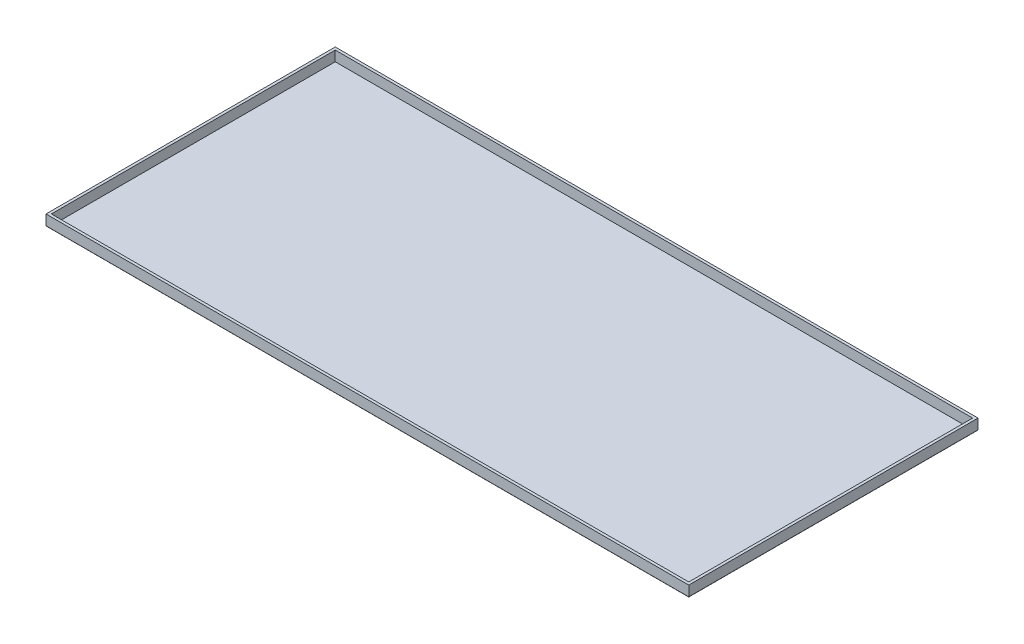
ISO-10303-21;
HEADER;
FILE_DESCRIPTION(('STEP AP214'),'2;1');
FILE_NAME('part.step','',(''),(''),'','','');
FILE_SCHEMA(('AUTOMOTIVE_DESIGN { 1 0 10303 214 1 1 1 1 }'));
ENDSEC;
DATA;
#1=APPLICATION_CONTEXT('core data for automotive mechanical design processes');
#2=APPLICATION_PROTOCOL_DEFINITION('international standard','automotive_design',2000,#1);
#3=PRODUCT_CONTEXT('',#1,'mechanical');
#4=PRODUCT('Part','Part','',(#3));
#5=PRODUCT_RELATED_PRODUCT_CATEGORY('part','',(#4));
#6=PRODUCT_DEFINITION_FORMATION('','',#4);
#7=PRODUCT_DEFINITION_CONTEXT('part definition',#1,'design');
#8=PRODUCT_DEFINITION('design','',#6,#7);
#9=PRODUCT_DEFINITION_SHAPE('','',#8);
#10=(LENGTH_UNIT() NAMED_UNIT(*) SI_UNIT(.MILLI.,.METRE.));
#11=(NAMED_UNIT(*) PLANE_ANGLE_UNIT() SI_UNIT($,.RADIAN.));
#12=(NAMED_UNIT(*) SI_UNIT($,.STERADIAN.) SOLID_ANGLE_UNIT());
#13=UNCERTAINTY_MEASURE_WITH_UNIT(LENGTH_MEASURE(1.E-05),#10,'distance_accuracy_value','');
#14=(GEOMETRIC_REPRESENTATION_CONTEXT(3) GLOBAL_UNCERTAINTY_ASSIGNED_CONTEXT((#13)) GLOBAL_UNIT_ASSIGNED_CONTEXT((#10,
#11,#12)) REPRESENTATION_CONTEXT('',''));
#15=CARTESIAN_POINT('',(0.,0.,0.));
#16=DIRECTION('',(0.,0.,1.));
#17=DIRECTION('',(1.,0.,0.));
#18=AXIS2_PLACEMENT_3D('',#15,#16,#17);
#19=CARTESIAN_POINT('',(0.,10.,0.));
#20=DIRECTION('',(0.,1.,0.));
#21=DIRECTION('',(0.,0.,1.));
#22=AXIS2_PLACEMENT_3D('',#19,#20,#21);
#23=PLANE('',#22);
#24=DIRECTION('',(0.,0.,1.));
#25=VECTOR('',#24,1.);
#26=CARTESIAN_POINT('',(-300.,10.,135.));
#27=LINE('',#26,#25);
#28=CARTESIAN_POINT('',(-300.,10.,-135.));
#29=VERTEX_POINT('',#28);
#30=CARTESIAN_POINT('',(-300.,10.,135.));
#31=VERTEX_POINT('',#30);
#32=EDGE_CURVE('E153',#29,#31,#27,.T.);
#33=ORIENTED_EDGE('',*,*,#32,.T.);
#34=DIRECTION('',(1.,0.,0.));
#35=VECTOR('',#34,1.);
#36=CARTESIAN_POINT('',(300.,10.,135.));
#37=LINE('',#36,#35);
#38=CARTESIAN_POINT('',(300.,10.,135.));
#39=VERTEX_POINT('',#38);
#40=EDGE_CURVE('E156',#31,#39,#37,.T.);
#41=ORIENTED_EDGE('',*,*,#40,.T.);
#42=DIRECTION('',(0.,0.,-1.));
#43=VECTOR('',#42,1.);
#44=CARTESIAN_POINT('',(300.,10.,135.));
#45=LINE('',#44,#43);
#46=CARTESIAN_POINT('',(300.,10.,-135.));
#47=VERTEX_POINT('',#46);
#48=EDGE_CURVE('E158',#39,#47,#45,.T.);
#49=ORIENTED_EDGE('',*,*,#48,.T.);
#50=DIRECTION('',(-1.,0.,0.));
#51=VECTOR('',#50,1.);
#52=CARTESIAN_POINT('',(300.,10.,-135.));
#53=LINE('',#52,#51);
#54=EDGE_CURVE('E160',#47,#29,#53,.T.);
#55=ORIENTED_EDGE('',*,*,#54,.T.);
#56=EDGE_LOOP('',(#33,#41,#49,#55));
#57=FACE_BOUND('',#56,.T.);
#58=DIRECTION('',(1.,0.,0.));
#59=VECTOR('',#58,1.);
#60=CARTESIAN_POINT('',(297.5,10.,132.5));
#61=LINE('',#60,#59);
#62=CARTESIAN_POINT('',(-297.5,10.,132.5));
#63=VERTEX_POINT('',#62);
#64=CARTESIAN_POINT('',(297.5,10.,132.5));
#65=VERTEX_POINT('',#64);
#66=EDGE_CURVE('E138',#63,#65,#61,.T.);
#67=ORIENTED_EDGE('',*,*,#66,.F.);
#68=DIRECTION('',(0.,0.,1.));
#69=VECTOR('',#68,1.);
#70=CARTESIAN_POINT('',(-297.5,10.,132.5));
#71=LINE('',#70,#69);
#72=CARTESIAN_POINT('',(-297.5,10.,-132.5));
#73=VERTEX_POINT('',#72);
#74=EDGE_CURVE('E136',#73,#63,#71,.T.);
#75=ORIENTED_EDGE('',*,*,#74,.F.);
#76=DIRECTION('',(-1.,0.,0.));
#77=VECTOR('',#76,1.);
#78=CARTESIAN_POINT('',(297.5,10.,-132.5));
#79=LINE('',#78,#77);
#80=CARTESIAN_POINT('',(297.5,10.,-132.5));
#81=VERTEX_POINT('',#80);
#82=EDGE_CURVE('E118',#81,#73,#79,.T.);
#83=ORIENTED_EDGE('',*,*,#82,.F.);
#84=DIRECTION('',(0.,0.,-1.));
#85=VECTOR('',#84,1.);
#86=CARTESIAN_POINT('',(297.5,10.,132.5));
#87=LINE('',#86,#85);
#88=EDGE_CURVE('E144',#65,#81,#87,.T.);
#89=ORIENTED_EDGE('',*,*,#88,.F.);
#90=EDGE_LOOP('',(#67,#75,#83,#89));
#91=FACE_BOUND('',#90,.T.);
#92=ADVANCED_FACE('F33',(#57,#91),#23,.T.);
#93=CARTESIAN_POINT('',(0.,0.,0.));
#94=DIRECTION('',(0.,1.,0.));
#95=DIRECTION('',(0.,0.,1.));
#96=AXIS2_PLACEMENT_3D('',#93,#94,#95);
#97=PLANE('',#96);
#98=DIRECTION('',(1.,0.,0.));
#99=VECTOR('',#98,1.);
#100=CARTESIAN_POINT('',(0.,0.,134.5));
#101=LINE('',#100,#99);
#102=CARTESIAN_POINT('',(299.5,0.,134.5));
#103=VERTEX_POINT('',#102);
#104=CARTESIAN_POINT('',(-299.5,0.,134.5));
#105=VERTEX_POINT('',#104);
#106=EDGE_CURVE('E174',#103,#105,#101,.F.);
#107=ORIENTED_EDGE('',*,*,#106,.T.);
#108=DIRECTION('',(0.,0.,1.));
#109=VECTOR('',#108,1.);
#110=CARTESIAN_POINT('',(-299.5,0.,0.));
#111=LINE('',#110,#109);
#112=CARTESIAN_POINT('',(-299.5,0.,-134.5));
#113=VERTEX_POINT('',#112);
#114=EDGE_CURVE('E180',#105,#113,#111,.F.);
#115=ORIENTED_EDGE('',*,*,#114,.T.);
#116=DIRECTION('',(-1.,0.,0.));
#117=VECTOR('',#116,1.);
#118=CARTESIAN_POINT('',(0.,0.,-134.5));
#119=LINE('',#118,#117);
#120=CARTESIAN_POINT('',(299.5,0.,-134.5));
#121=VERTEX_POINT('',#120);
#122=EDGE_CURVE('E178',#113,#121,#119,.F.);
#123=ORIENTED_EDGE('',*,*,#122,.T.);
#124=DIRECTION('',(0.,0.,-1.));
#125=VECTOR('',#124,1.);
#126=CARTESIAN_POINT('',(299.5,0.,0.));
#127=LINE('',#126,#125);
#128=EDGE_CURVE('E176',#121,#103,#127,.F.);
#129=ORIENTED_EDGE('',*,*,#128,.T.);
#130=EDGE_LOOP('',(#107,#115,#123,#129));
#131=FACE_BOUND('',#130,.T.);
#132=ADVANCED_FACE('F204',(#131),#97,.F.);
#133=CARTESIAN_POINT('',(-300.,10.,135.));
#134=DIRECTION('',(1.,0.,0.));
#135=DIRECTION('',(0.,0.,-1.));
#136=AXIS2_PLACEMENT_3D('',#133,#134,#135);
#137=PLANE('',#136);
#138=DIRECTION('',(0.,-1.,0.));
#139=VECTOR('',#138,1.);
#140=CARTESIAN_POINT('',(-300.,10.,-135.));
#141=LINE('',#140,#139);
#142=CARTESIAN_POINT('',(-300.,0.5,-135.));
#143=VERTEX_POINT('',#142);
#144=EDGE_CURVE('E162',#29,#143,#141,.T.);
#145=ORIENTED_EDGE('',*,*,#144,.T.);
#146=DIRECTION('',(0.,0.,1.));
#147=VECTOR('',#146,1.);
#148=CARTESIAN_POINT('',(-300.,0.5,135.));
#149=LINE('',#148,#147);
#150=CARTESIAN_POINT('',(-300.,0.5,135.));
#151=VERTEX_POINT('',#150);
#152=EDGE_CURVE('E171',#143,#151,#149,.T.);
#153=ORIENTED_EDGE('',*,*,#152,.T.);
#154=DIRECTION('',(0.,-1.,0.));
#155=VECTOR('',#154,1.);
#156=CARTESIAN_POINT('',(-300.,10.,135.));
#157=LINE('',#156,#155);
#158=EDGE_CURVE('E169',#31,#151,#157,.T.);
#159=ORIENTED_EDGE('',*,*,#158,.F.);
#160=ORIENTED_EDGE('',*,*,#32,.F.);
#161=EDGE_LOOP('',(#145,#153,#159,#160));
#162=FACE_BOUND('',#161,.T.);
#163=ADVANCED_FACE('F213',(#162),#137,.F.);
#164=CARTESIAN_POINT('',(300.,10.,135.));
#165=DIRECTION('',(0.,0.,-1.));
#166=DIRECTION('',(-1.,0.,0.));
#167=AXIS2_PLACEMENT_3D('',#164,#165,#166);
#168=PLANE('',#167);
#169=ORIENTED_EDGE('',*,*,#158,.T.);
#170=DIRECTION('',(1.,0.,0.));
#171=VECTOR('',#170,1.);
#172=CARTESIAN_POINT('',(300.,0.5,135.));
#173=LINE('',#172,#171);
#174=CARTESIAN_POINT('',(300.,0.5,135.));
#175=VERTEX_POINT('',#174);
#176=EDGE_CURVE('E11',#151,#175,#173,.T.);
#177=ORIENTED_EDGE('',*,*,#176,.T.);
#178=DIRECTION('',(0.,-1.,0.));
#179=VECTOR('',#178,1.);
#180=CARTESIAN_POINT('',(300.,10.,135.));
#181=LINE('',#180,#179);
#182=EDGE_CURVE('E167',#39,#175,#181,.T.);
#183=ORIENTED_EDGE('',*,*,#182,.F.);
#184=ORIENTED_EDGE('',*,*,#40,.F.);
#185=EDGE_LOOP('',(#169,#177,#183,#184));
#186=FACE_BOUND('',#185,.T.);
#187=ADVANCED_FACE('F216',(#186),#168,.F.);
#188=CARTESIAN_POINT('',(300.,10.,135.));
#189=DIRECTION('',(-1.,0.,0.));
#190=DIRECTION('',(0.,0.,1.));
#191=AXIS2_PLACEMENT_3D('',#188,#189,#190);
#192=PLANE('',#191);
#193=ORIENTED_EDGE('',*,*,#182,.T.);
#194=DIRECTION('',(0.,0.,-1.));
#195=VECTOR('',#194,1.);
#196=CARTESIAN_POINT('',(300.,0.5,135.));
#197=LINE('',#196,#195);
#198=CARTESIAN_POINT('',(300.,0.5,-135.));
#199=VERTEX_POINT('',#198);
#200=EDGE_CURVE('E42',#175,#199,#197,.T.);
#201=ORIENTED_EDGE('',*,*,#200,.T.);
#202=DIRECTION('',(0.,-1.,0.));
#203=VECTOR('',#202,1.);
#204=CARTESIAN_POINT('',(300.,10.,-135.));
#205=LINE('',#204,#203);
#206=EDGE_CURVE('E165',#47,#199,#205,.T.);
#207=ORIENTED_EDGE('',*,*,#206,.F.);
#208=ORIENTED_EDGE('',*,*,#48,.F.);
#209=EDGE_LOOP('',(#193,#201,#207,#208));
#210=FACE_BOUND('',#209,.T.);
#211=ADVANCED_FACE('F223',(#210),#192,.F.);
#212=CARTESIAN_POINT('',(300.,10.,-135.));
#213=DIRECTION('',(0.,0.,1.));
#214=DIRECTION('',(1.,0.,0.));
#215=AXIS2_PLACEMENT_3D('',#212,#213,#214);
#216=PLANE('',#215);
#217=ORIENTED_EDGE('',*,*,#206,.T.);
#218=DIRECTION('',(-1.,0.,0.));
#219=VECTOR('',#218,1.);
#220=CARTESIAN_POINT('',(300.,0.5,-135.));
#221=LINE('',#220,#219);
#222=EDGE_CURVE('E183',#199,#143,#221,.T.);
#223=ORIENTED_EDGE('',*,*,#222,.T.);
#224=ORIENTED_EDGE('',*,*,#144,.F.);
#225=ORIENTED_EDGE('',*,*,#54,.F.);
#226=EDGE_LOOP('',(#217,#223,#224,#225));
#227=FACE_BOUND('',#226,.T.);
#228=ADVANCED_FACE('F222',(#227),#216,.F.);
#229=CARTESIAN_POINT('',(-297.5,10.,132.5));
#230=DIRECTION('',(1.,0.,0.));
#231=DIRECTION('',(0.,0.,-1.));
#232=AXIS2_PLACEMENT_3D('',#229,#230,#231);
#233=PLANE('',#232);
#234=DIRECTION('',(0.,0.,1.));
#235=VECTOR('',#234,1.);
#236=CARTESIAN_POINT('',(-297.5,0.5,132.5));
#237=LINE('',#236,#235);
#238=CARTESIAN_POINT('',(-297.5,0.5,-132.5));
#239=VERTEX_POINT('',#238);
#240=CARTESIAN_POINT('',(-297.5,0.5,132.5));
#241=VERTEX_POINT('',#240);
#242=EDGE_CURVE('E125',#239,#241,#237,.T.);
#243=ORIENTED_EDGE('',*,*,#242,.F.);
#244=DIRECTION('',(0.,-1.,0.));
#245=VECTOR('',#244,1.);
#246=CARTESIAN_POINT('',(-297.5,10.,-132.5));
#247=LINE('',#246,#245);
#248=EDGE_CURVE('E111',#73,#239,#247,.T.);
#249=ORIENTED_EDGE('',*,*,#248,.F.);
#250=ORIENTED_EDGE('',*,*,#74,.T.);
#251=DIRECTION('',(0.,-1.,0.));
#252=VECTOR('',#251,1.);
#253=CARTESIAN_POINT('',(-297.5,10.,132.5));
#254=LINE('',#253,#252);
#255=EDGE_CURVE('E128',#63,#241,#254,.T.);
#256=ORIENTED_EDGE('',*,*,#255,.T.);
#257=EDGE_LOOP('',(#243,#249,#250,#256));
#258=FACE_BOUND('',#257,.T.);
#259=ADVANCED_FACE('F126',(#258),#233,.T.);
#260=CARTESIAN_POINT('',(297.5,10.,132.5));
#261=DIRECTION('',(0.,0.,-1.));
#262=DIRECTION('',(-1.,0.,0.));
#263=AXIS2_PLACEMENT_3D('',#260,#261,#262);
#264=PLANE('',#263);
#265=DIRECTION('',(1.,0.,0.));
#266=VECTOR('',#265,1.);
#267=CARTESIAN_POINT('',(297.5,0.5,132.5));
#268=LINE('',#267,#266);
#269=CARTESIAN_POINT('',(297.5,0.5,132.5));
#270=VERTEX_POINT('',#269);
#271=EDGE_CURVE('E131',#241,#270,#268,.T.);
#272=ORIENTED_EDGE('',*,*,#271,.F.);
#273=ORIENTED_EDGE('',*,*,#255,.F.);
#274=ORIENTED_EDGE('',*,*,#66,.T.);
#275=DIRECTION('',(0.,-1.,0.));
#276=VECTOR('',#275,1.);
#277=CARTESIAN_POINT('',(297.5,10.,132.5));
#278=LINE('',#277,#276);
#279=EDGE_CURVE('E149',#65,#270,#278,.T.);
#280=ORIENTED_EDGE('',*,*,#279,.T.);
#281=EDGE_LOOP('',(#272,#273,#274,#280));
#282=FACE_BOUND('',#281,.T.);
#283=ADVANCED_FACE('F241',(#282),#264,.T.);
#284=CARTESIAN_POINT('',(297.5,10.,132.5));
#285=DIRECTION('',(-1.,0.,0.));
#286=DIRECTION('',(0.,0.,1.));
#287=AXIS2_PLACEMENT_3D('',#284,#285,#286);
#288=PLANE('',#287);
#289=DIRECTION('',(0.,0.,-1.));
#290=VECTOR('',#289,1.);
#291=CARTESIAN_POINT('',(297.5,0.5,132.5));
#292=LINE('',#291,#290);
#293=CARTESIAN_POINT('',(297.5,0.5,-132.5));
#294=VERTEX_POINT('',#293);
#295=EDGE_CURVE('E135',#270,#294,#292,.T.);
#296=ORIENTED_EDGE('',*,*,#295,.F.);
#297=ORIENTED_EDGE('',*,*,#279,.F.);
#298=ORIENTED_EDGE('',*,*,#88,.T.);
#299=DIRECTION('',(0.,-1.,0.));
#300=VECTOR('',#299,1.);
#301=CARTESIAN_POINT('',(297.5,10.,-132.5));
#302=LINE('',#301,#300);
#303=EDGE_CURVE('E121',#81,#294,#302,.T.);
#304=ORIENTED_EDGE('',*,*,#303,.T.);
#305=EDGE_LOOP('',(#296,#297,#298,#304));
#306=FACE_BOUND('',#305,.T.);
#307=ADVANCED_FACE('F244',(#306),#288,.T.);
#308=CARTESIAN_POINT('',(297.5,10.,-132.5));
#309=DIRECTION('',(0.,0.,1.));
#310=DIRECTION('',(1.,0.,0.));
#311=AXIS2_PLACEMENT_3D('',#308,#309,#310);
#312=PLANE('',#311);
#313=DIRECTION('',(-1.,0.,0.));
#314=VECTOR('',#313,1.);
#315=CARTESIAN_POINT('',(297.5,0.5,-132.5));
#316=LINE('',#315,#314);
#317=EDGE_CURVE('E115',#294,#239,#316,.T.);
#318=ORIENTED_EDGE('',*,*,#317,.F.);
#319=ORIENTED_EDGE('',*,*,#303,.F.);
#320=ORIENTED_EDGE('',*,*,#82,.T.);
#321=ORIENTED_EDGE('',*,*,#248,.T.);
#322=EDGE_LOOP('',(#318,#319,#320,#321));
#323=FACE_BOUND('',#322,.T.);
#324=ADVANCED_FACE('F113',(#323),#312,.T.);
#325=CARTESIAN_POINT('',(0.,0.5,0.));
#326=DIRECTION('',(0.,1.,0.));
#327=DIRECTION('',(0.,0.,1.));
#328=AXIS2_PLACEMENT_3D('',#325,#326,#327);
#329=PLANE('',#328);
#330=ORIENTED_EDGE('',*,*,#242,.T.);
#331=ORIENTED_EDGE('',*,*,#271,.T.);
#332=ORIENTED_EDGE('',*,*,#295,.T.);
#333=ORIENTED_EDGE('',*,*,#317,.T.);
#334=EDGE_LOOP('',(#330,#331,#332,#333));
#335=FACE_BOUND('',#334,.T.);
#336=ADVANCED_FACE('F134',(#335),#329,.T.);
#337=CARTESIAN_POINT('',(299.5,0.5,135.));
#338=DIRECTION('',(0.,0.,-1.));
#339=DIRECTION('',(-1.,0.,0.));
#340=AXIS2_PLACEMENT_3D('',#337,#338,#339);
#341=CYLINDRICAL_SURFACE('',#340,0.5);
#342=CARTESIAN_POINT('',(299.5,0.5,134.5));
#343=DIRECTION('',(0.707106781186547,0.,-0.707106781186548));
#344=DIRECTION('',(0.707106781186548,0.,0.707106781186547));
#345=AXIS2_PLACEMENT_3D('',#342,#343,#344);
#346=ELLIPSE('',#345,0.707106781186547,0.5);
#347=EDGE_CURVE('E189',#103,#175,#346,.F.);
#348=ORIENTED_EDGE('',*,*,#347,.F.);
#349=ORIENTED_EDGE('',*,*,#128,.F.);
#350=CARTESIAN_POINT('',(299.5,0.5,-134.5));
#351=DIRECTION('',(-0.707106781186548,0.,-0.707106781186547));
#352=DIRECTION('',(0.707106781186547,0.,-0.707106781186548));
#353=AXIS2_PLACEMENT_3D('',#350,#351,#352);
#354=ELLIPSE('',#353,0.707106781186548,0.5);
#355=EDGE_CURVE('E37',#199,#121,#354,.T.);
#356=ORIENTED_EDGE('',*,*,#355,.F.);
#357=ORIENTED_EDGE('',*,*,#200,.F.);
#358=EDGE_LOOP('',(#348,#349,#356,#357));
#359=FACE_BOUND('',#358,.T.);
#360=ADVANCED_FACE('F35',(#359),#341,.T.);
#361=CARTESIAN_POINT('',(300.,0.5,-134.5));
#362=DIRECTION('',(-1.,0.,0.));
#363=DIRECTION('',(0.,0.,1.));
#364=AXIS2_PLACEMENT_3D('',#361,#362,#363);
#365=CYLINDRICAL_SURFACE('',#364,0.5);
#366=ORIENTED_EDGE('',*,*,#355,.T.);
#367=ORIENTED_EDGE('',*,*,#122,.F.);
#368=CARTESIAN_POINT('',(-299.5,0.5,-134.5));
#369=DIRECTION('',(-0.707106781186547,0.,0.707106781186548));
#370=DIRECTION('',(-0.707106781186548,0.,-0.707106781186547));
#371=AXIS2_PLACEMENT_3D('',#368,#369,#370);
#372=ELLIPSE('',#371,0.707106781186547,0.5);
#373=EDGE_CURVE('E188',#143,#113,#372,.T.);
#374=ORIENTED_EDGE('',*,*,#373,.F.);
#375=ORIENTED_EDGE('',*,*,#222,.F.);
#376=EDGE_LOOP('',(#366,#367,#374,#375));
#377=FACE_BOUND('',#376,.T.);
#378=ADVANCED_FACE('F199',(#377),#365,.T.);
#379=CARTESIAN_POINT('',(300.,0.5,134.5));
#380=DIRECTION('',(1.,0.,0.));
#381=DIRECTION('',(0.,0.,-1.));
#382=AXIS2_PLACEMENT_3D('',#379,#380,#381);
#383=CYLINDRICAL_SURFACE('',#382,0.5);
#384=ORIENTED_EDGE('',*,*,#347,.T.);
#385=ORIENTED_EDGE('',*,*,#176,.F.);
#386=CARTESIAN_POINT('',(-299.5,0.5,134.5));
#387=DIRECTION('',(0.707106781186548,0.,0.707106781186547));
#388=DIRECTION('',(0.707106781186547,0.,-0.707106781186548));
#389=AXIS2_PLACEMENT_3D('',#386,#387,#388);
#390=ELLIPSE('',#389,0.707106781186548,0.5);
#391=EDGE_CURVE('E186',#105,#151,#390,.F.);
#392=ORIENTED_EDGE('',*,*,#391,.F.);
#393=ORIENTED_EDGE('',*,*,#106,.F.);
#394=EDGE_LOOP('',(#384,#385,#392,#393));
#395=FACE_BOUND('',#394,.T.);
#396=ADVANCED_FACE('F210',(#395),#383,.T.);
#397=CARTESIAN_POINT('',(-299.5,0.5,135.));
#398=DIRECTION('',(0.,0.,1.));
#399=DIRECTION('',(1.,0.,0.));
#400=AXIS2_PLACEMENT_3D('',#397,#398,#399);
#401=CYLINDRICAL_SURFACE('',#400,0.5);
#402=ORIENTED_EDGE('',*,*,#373,.T.);
#403=ORIENTED_EDGE('',*,*,#114,.F.);
#404=ORIENTED_EDGE('',*,*,#391,.T.);
#405=ORIENTED_EDGE('',*,*,#152,.F.);
#406=EDGE_LOOP('',(#402,#403,#404,#405));
#407=FACE_BOUND('',#406,.T.);
#408=ADVANCED_FACE('F208',(#407),#401,.T.);
#409=CLOSED_SHELL('',(#92,#132,#163,#187,#211,#228,#259,#283,#307,#324,#336,#360,#378,#396,#408));
#410=MANIFOLD_SOLID_BREP('B2',#409);
#411=ADVANCED_BREP_SHAPE_REPRESENTATION('',(#18,#410),#14);
#412=SHAPE_DEFINITION_REPRESENTATION(#9,#411);
ENDSEC;
END-ISO-10303-21;
